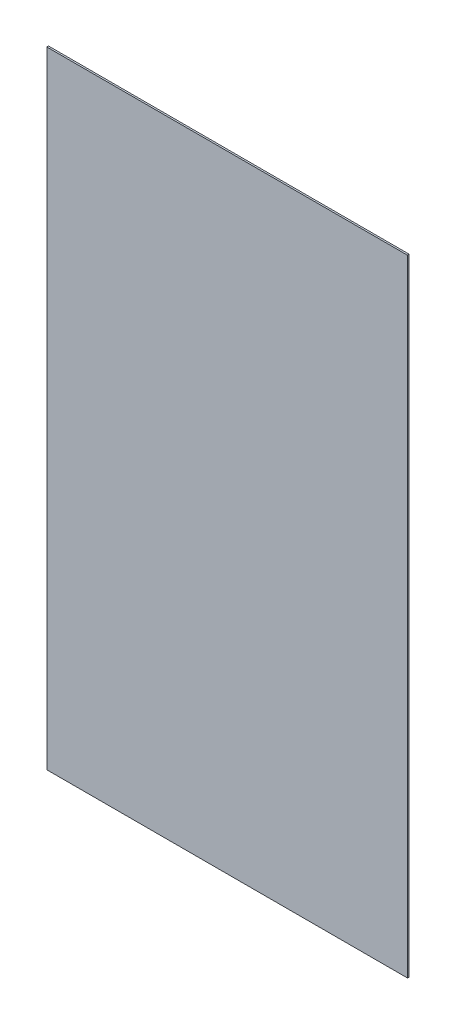
ISO-10303-21;
HEADER;
FILE_DESCRIPTION(('STEP AP214'),'2;1');
FILE_NAME('part.step','',(''),(''),'','','');
FILE_SCHEMA(('AUTOMOTIVE_DESIGN { 1 0 10303 214 1 1 1 1 }'));
ENDSEC;
DATA;
#1=APPLICATION_CONTEXT('core data for automotive mechanical design processes');
#2=APPLICATION_PROTOCOL_DEFINITION('international standard','automotive_design',2000,#1);
#3=PRODUCT_CONTEXT('',#1,'mechanical');
#4=PRODUCT('Part','Part','',(#3));
#5=PRODUCT_RELATED_PRODUCT_CATEGORY('part','',(#4));
#6=PRODUCT_DEFINITION_FORMATION('','',#4);
#7=PRODUCT_DEFINITION_CONTEXT('part definition',#1,'design');
#8=PRODUCT_DEFINITION('design','',#6,#7);
#9=PRODUCT_DEFINITION_SHAPE('','',#8);
#10=(LENGTH_UNIT() NAMED_UNIT(*) SI_UNIT(.MILLI.,.METRE.));
#11=(NAMED_UNIT(*) PLANE_ANGLE_UNIT() SI_UNIT($,.RADIAN.));
#12=(NAMED_UNIT(*) SI_UNIT($,.STERADIAN.) SOLID_ANGLE_UNIT());
#13=UNCERTAINTY_MEASURE_WITH_UNIT(LENGTH_MEASURE(1.E-05),#10,'distance_accuracy_value','');
#14=(GEOMETRIC_REPRESENTATION_CONTEXT(3) GLOBAL_UNCERTAINTY_ASSIGNED_CONTEXT((#13)) GLOBAL_UNIT_ASSIGNED_CONTEXT((#10,
#11,#12)) REPRESENTATION_CONTEXT('',''));
#15=CARTESIAN_POINT('',(0.,0.,0.));
#16=DIRECTION('',(0.,0.,1.));
#17=DIRECTION('',(1.,0.,0.));
#18=AXIS2_PLACEMENT_3D('',#15,#16,#17);
#19=CARTESIAN_POINT('',(0.,0.,3.175));
#20=DIRECTION('',(0.,0.,1.));
#21=DIRECTION('',(1.,0.,0.));
#22=AXIS2_PLACEMENT_3D('',#19,#20,#21);
#23=PLANE('',#22);
#24=DIRECTION('',(1.,0.,0.));
#25=VECTOR('',#24,1.);
#26=CARTESIAN_POINT('',(673.1,1168.4,3.175));
#27=LINE('',#26,#25);
#28=CARTESIAN_POINT('',(0.,1168.4,3.175));
#29=VERTEX_POINT('',#28);
#30=CARTESIAN_POINT('',(673.1,1168.4,3.175));
#31=VERTEX_POINT('',#30);
#32=EDGE_CURVE('E57',#29,#31,#27,.T.);
#33=ORIENTED_EDGE('',*,*,#32,.F.);
#34=DIRECTION('',(0.,1.,0.));
#35=VECTOR('',#34,1.);
#36=CARTESIAN_POINT('',(0.,1168.4,3.175));
#37=LINE('',#36,#35);
#38=CARTESIAN_POINT('',(0.,0.,3.175));
#39=VERTEX_POINT('',#38);
#40=EDGE_CURVE('E52',#39,#29,#37,.T.);
#41=ORIENTED_EDGE('',*,*,#40,.F.);
#42=DIRECTION('',(1.,0.,0.));
#43=VECTOR('',#42,1.);
#44=CARTESIAN_POINT('',(0.,0.,3.175));
#45=LINE('',#44,#43);
#46=CARTESIAN_POINT('',(673.1,0.,3.175));
#47=VERTEX_POINT('',#46);
#48=EDGE_CURVE('E67',#47,#39,#45,.F.);
#49=ORIENTED_EDGE('',*,*,#48,.F.);
#50=DIRECTION('',(0.,1.,0.));
#51=VECTOR('',#50,1.);
#52=CARTESIAN_POINT('',(673.1,0.,3.175));
#53=LINE('',#52,#51);
#54=EDGE_CURVE('E19',#31,#47,#53,.F.);
#55=ORIENTED_EDGE('',*,*,#54,.F.);
#56=EDGE_LOOP('',(#33,#41,#49,#55));
#57=FACE_BOUND('',#56,.T.);
#58=ADVANCED_FACE('F16',(#57),#23,.T.);
#59=CARTESIAN_POINT('',(673.1,0.,0.));
#60=DIRECTION('',(1.,0.,0.));
#61=DIRECTION('',(0.,0.,-1.));
#62=AXIS2_PLACEMENT_3D('',#59,#60,#61);
#63=PLANE('',#62);
#64=ORIENTED_EDGE('',*,*,#54,.T.);
#65=DIRECTION('',(0.,0.,-1.));
#66=VECTOR('',#65,1.);
#67=CARTESIAN_POINT('',(673.1,0.,0.));
#68=LINE('',#67,#66);
#69=CARTESIAN_POINT('',(673.1,0.,0.));
#70=VERTEX_POINT('',#69);
#71=EDGE_CURVE('E78',#70,#47,#68,.F.);
#72=ORIENTED_EDGE('',*,*,#71,.F.);
#73=DIRECTION('',(0.,1.,0.));
#74=VECTOR('',#73,1.);
#75=CARTESIAN_POINT('',(673.1,0.,0.));
#76=LINE('',#75,#74);
#77=CARTESIAN_POINT('',(673.1,1168.4,0.));
#78=VERTEX_POINT('',#77);
#79=EDGE_CURVE('E73',#70,#78,#76,.T.);
#80=ORIENTED_EDGE('',*,*,#79,.T.);
#81=DIRECTION('',(0.,0.,1.));
#82=VECTOR('',#81,1.);
#83=CARTESIAN_POINT('',(673.1,1168.4,0.));
#84=LINE('',#83,#82);
#85=EDGE_CURVE('E62',#31,#78,#84,.F.);
#86=ORIENTED_EDGE('',*,*,#85,.F.);
#87=EDGE_LOOP('',(#64,#72,#80,#86));
#88=FACE_BOUND('',#87,.T.);
#89=ADVANCED_FACE('F72',(#88),#63,.T.);
#90=CARTESIAN_POINT('',(673.1,1168.4,0.));
#91=DIRECTION('',(0.,1.,0.));
#92=DIRECTION('',(0.,0.,1.));
#93=AXIS2_PLACEMENT_3D('',#90,#91,#92);
#94=PLANE('',#93);
#95=ORIENTED_EDGE('',*,*,#32,.T.);
#96=ORIENTED_EDGE('',*,*,#85,.T.);
#97=DIRECTION('',(1.,0.,0.));
#98=VECTOR('',#97,1.);
#99=CARTESIAN_POINT('',(0.,1168.4,0.));
#100=LINE('',#99,#98);
#101=CARTESIAN_POINT('',(0.,1168.4,0.));
#102=VERTEX_POINT('',#101);
#103=EDGE_CURVE('E83',#78,#102,#100,.F.);
#104=ORIENTED_EDGE('',*,*,#103,.T.);
#105=DIRECTION('',(0.,0.,1.));
#106=VECTOR('',#105,1.);
#107=CARTESIAN_POINT('',(0.,1168.4,0.));
#108=LINE('',#107,#106);
#109=EDGE_CURVE('E64',#29,#102,#108,.F.);
#110=ORIENTED_EDGE('',*,*,#109,.F.);
#111=EDGE_LOOP('',(#95,#96,#104,#110));
#112=FACE_BOUND('',#111,.T.);
#113=ADVANCED_FACE('F59',(#112),#94,.T.);
#114=CARTESIAN_POINT('',(0.,1168.4,0.));
#115=DIRECTION('',(-1.,0.,0.));
#116=DIRECTION('',(0.,0.,1.));
#117=AXIS2_PLACEMENT_3D('',#114,#115,#116);
#118=PLANE('',#117);
#119=ORIENTED_EDGE('',*,*,#40,.T.);
#120=ORIENTED_EDGE('',*,*,#109,.T.);
#121=DIRECTION('',(0.,1.,0.));
#122=VECTOR('',#121,1.);
#123=CARTESIAN_POINT('',(0.,0.,0.));
#124=LINE('',#123,#122);
#125=CARTESIAN_POINT('',(0.,0.,0.));
#126=VERTEX_POINT('',#125);
#127=EDGE_CURVE('E25',#102,#126,#124,.F.);
#128=ORIENTED_EDGE('',*,*,#127,.T.);
#129=DIRECTION('',(0.,0.,-1.));
#130=VECTOR('',#129,1.);
#131=CARTESIAN_POINT('',(0.,0.,0.));
#132=LINE('',#131,#130);
#133=EDGE_CURVE('E33',#39,#126,#132,.T.);
#134=ORIENTED_EDGE('',*,*,#133,.F.);
#135=EDGE_LOOP('',(#119,#120,#128,#134));
#136=FACE_BOUND('',#135,.T.);
#137=ADVANCED_FACE('F87',(#136),#118,.T.);
#138=CARTESIAN_POINT('',(0.,0.,0.));
#139=DIRECTION('',(0.,-1.,0.));
#140=DIRECTION('',(0.,0.,-1.));
#141=AXIS2_PLACEMENT_3D('',#138,#139,#140);
#142=PLANE('',#141);
#143=ORIENTED_EDGE('',*,*,#48,.T.);
#144=ORIENTED_EDGE('',*,*,#133,.T.);
#145=DIRECTION('',(1.,0.,0.));
#146=VECTOR('',#145,1.);
#147=CARTESIAN_POINT('',(0.,0.,0.));
#148=LINE('',#147,#146);
#149=EDGE_CURVE('E11',#126,#70,#148,.T.);
#150=ORIENTED_EDGE('',*,*,#149,.T.);
#151=ORIENTED_EDGE('',*,*,#71,.T.);
#152=EDGE_LOOP('',(#143,#144,#150,#151));
#153=FACE_BOUND('',#152,.T.);
#154=ADVANCED_FACE('F90',(#153),#142,.T.);
#155=CARTESIAN_POINT('',(0.,0.,0.));
#156=DIRECTION('',(0.,0.,1.));
#157=DIRECTION('',(1.,0.,0.));
#158=AXIS2_PLACEMENT_3D('',#155,#156,#157);
#159=PLANE('',#158);
#160=ORIENTED_EDGE('',*,*,#127,.F.);
#161=ORIENTED_EDGE('',*,*,#103,.F.);
#162=ORIENTED_EDGE('',*,*,#79,.F.);
#163=ORIENTED_EDGE('',*,*,#149,.F.);
#164=EDGE_LOOP('',(#160,#161,#162,#163));
#165=FACE_BOUND('',#164,.T.);
#166=ADVANCED_FACE('F89',(#165),#159,.F.);
#167=CLOSED_SHELL('',(#58,#89,#113,#137,#154,#166));
#168=MANIFOLD_SOLID_BREP('B1',#167);
#169=ADVANCED_BREP_SHAPE_REPRESENTATION('',(#18,#168),#14);
#170=SHAPE_DEFINITION_REPRESENTATION(#9,#169);
ENDSEC;
END-ISO-10303-21;
